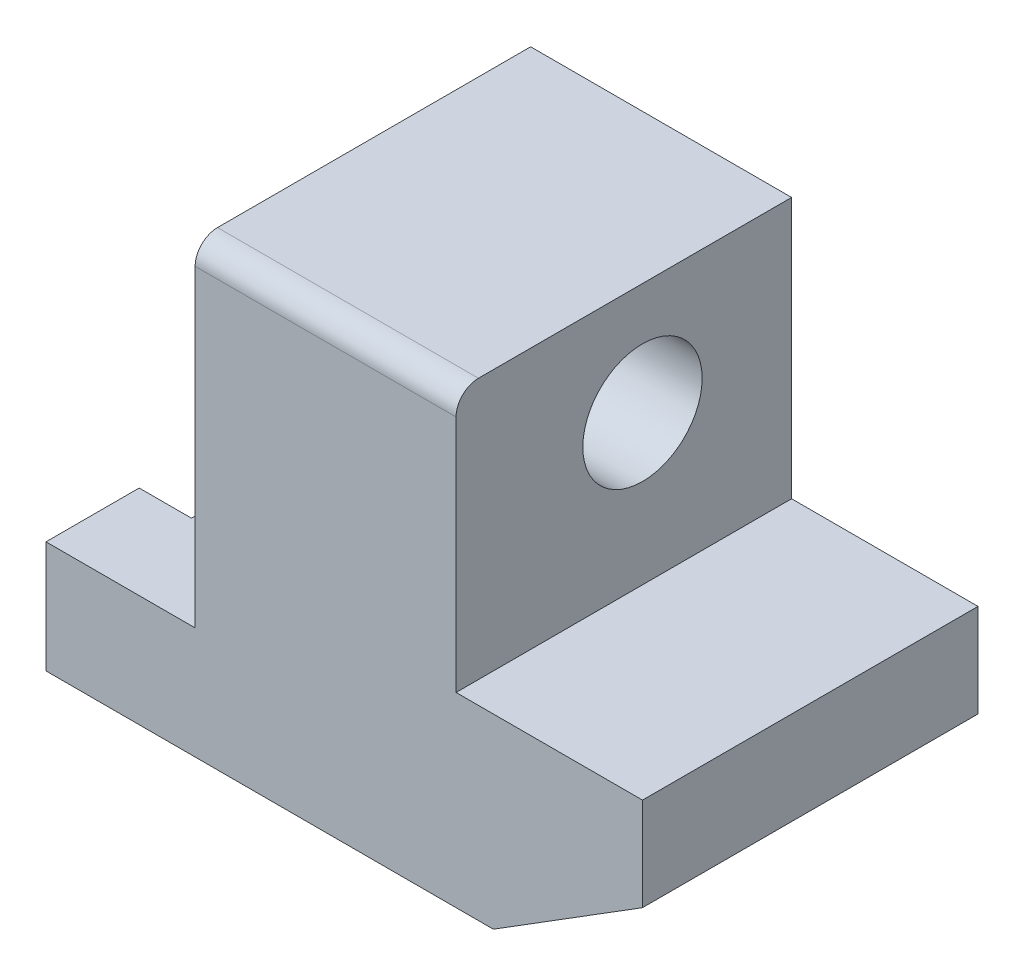
ISO-10303-21;
HEADER;
FILE_DESCRIPTION(('STEP AP214'),'2;1');
FILE_NAME('part.step','',(''),(''),'','','');
FILE_SCHEMA(('AUTOMOTIVE_DESIGN { 1 0 10303 214 1 1 1 1 }'));
ENDSEC;
DATA;
#1=APPLICATION_CONTEXT('core data for automotive mechanical design processes');
#2=APPLICATION_PROTOCOL_DEFINITION('international standard','automotive_design',2000,#1);
#3=PRODUCT_CONTEXT('',#1,'mechanical');
#4=PRODUCT('Part','Part','',(#3));
#5=PRODUCT_RELATED_PRODUCT_CATEGORY('part','',(#4));
#6=PRODUCT_DEFINITION_FORMATION('','',#4);
#7=PRODUCT_DEFINITION_CONTEXT('part definition',#1,'design');
#8=PRODUCT_DEFINITION('design','',#6,#7);
#9=PRODUCT_DEFINITION_SHAPE('','',#8);
#10=(LENGTH_UNIT() NAMED_UNIT(*) SI_UNIT(.MILLI.,.METRE.));
#11=(NAMED_UNIT(*) PLANE_ANGLE_UNIT() SI_UNIT($,.RADIAN.));
#12=(NAMED_UNIT(*) SI_UNIT($,.STERADIAN.) SOLID_ANGLE_UNIT());
#13=UNCERTAINTY_MEASURE_WITH_UNIT(LENGTH_MEASURE(1.E-05),#10,'distance_accuracy_value','');
#14=(GEOMETRIC_REPRESENTATION_CONTEXT(3) GLOBAL_UNCERTAINTY_ASSIGNED_CONTEXT((#13)) GLOBAL_UNIT_ASSIGNED_CONTEXT((#10,
#11,#12)) REPRESENTATION_CONTEXT('',''));
#15=CARTESIAN_POINT('',(0.,0.,0.));
#16=DIRECTION('',(0.,0.,1.));
#17=DIRECTION('',(1.,0.,0.));
#18=AXIS2_PLACEMENT_3D('',#15,#16,#17);
#19=CARTESIAN_POINT('',(0.,0.,0.));
#20=DIRECTION('',(1.,0.,0.));
#21=DIRECTION('',(0.,0.,-1.));
#22=AXIS2_PLACEMENT_3D('',#19,#20,#21);
#23=PLANE('',#22);
#24=DIRECTION('',(0.,0.,-1.));
#25=VECTOR('',#24,1.);
#26=CARTESIAN_POINT('',(0.,0.,0.));
#27=LINE('',#26,#25);
#28=CARTESIAN_POINT('',(0.,0.,-65.));
#29=VERTEX_POINT('',#28);
#30=CARTESIAN_POINT('',(0.,0.,-90.));
#31=VERTEX_POINT('',#30);
#32=EDGE_CURVE('E152',#29,#31,#27,.T.);
#33=ORIENTED_EDGE('',*,*,#32,.F.);
#34=DIRECTION('',(0.,-1.,0.));
#35=VECTOR('',#34,1.);
#36=CARTESIAN_POINT('',(0.,0.,-65.));
#37=LINE('',#36,#35);
#38=CARTESIAN_POINT('',(0.,30.,-65.));
#39=VERTEX_POINT('',#38);
#40=EDGE_CURVE('E265',#39,#29,#37,.T.);
#41=ORIENTED_EDGE('',*,*,#40,.F.);
#42=DIRECTION('',(0.,0.,1.));
#43=VECTOR('',#42,1.);
#44=CARTESIAN_POINT('',(0.,30.,0.));
#45=LINE('',#44,#43);
#46=CARTESIAN_POINT('',(0.,30.,-90.));
#47=VERTEX_POINT('',#46);
#48=EDGE_CURVE('E228',#47,#39,#45,.T.);
#49=ORIENTED_EDGE('',*,*,#48,.F.);
#50=DIRECTION('',(0.,1.,0.));
#51=VECTOR('',#50,1.);
#52=CARTESIAN_POINT('',(0.,0.,-90.));
#53=LINE('',#52,#51);
#54=EDGE_CURVE('E225',#31,#47,#53,.T.);
#55=ORIENTED_EDGE('',*,*,#54,.F.);
#56=EDGE_LOOP('',(#33,#41,#49,#55));
#57=FACE_BOUND('',#56,.T.);
#58=ADVANCED_FACE('F33',(#57),#23,.F.);
#59=CARTESIAN_POINT('',(40.,0.,0.));
#60=DIRECTION('',(0.,1.,0.));
#61=DIRECTION('',(0.,0.,1.));
#62=AXIS2_PLACEMENT_3D('',#59,#60,#61);
#63=PLANE('',#62);
#64=DIRECTION('',(-1.,0.,0.));
#65=VECTOR('',#64,1.);
#66=CARTESIAN_POINT('',(40.,0.,-90.));
#67=LINE('',#66,#65);
#68=CARTESIAN_POINT('',(120.,0.,-90.));
#69=VERTEX_POINT('',#68);
#70=EDGE_CURVE('E144',#69,#31,#67,.T.);
#71=ORIENTED_EDGE('',*,*,#70,.F.);
#72=DIRECTION('',(0.,0.,1.));
#73=VECTOR('',#72,1.);
#74=CARTESIAN_POINT('',(120.,0.,-90.));
#75=LINE('',#74,#73);
#76=CARTESIAN_POINT('',(120.,0.,0.));
#77=VERTEX_POINT('',#76);
#78=EDGE_CURVE('E131',#69,#77,#75,.T.);
#79=ORIENTED_EDGE('',*,*,#78,.T.);
#80=DIRECTION('',(-1.,0.,0.));
#81=VECTOR('',#80,1.);
#82=CARTESIAN_POINT('',(40.,0.,0.));
#83=LINE('',#82,#81);
#84=CARTESIAN_POINT('',(0.,0.,0.));
#85=VERTEX_POINT('',#84);
#86=EDGE_CURVE('E220',#77,#85,#83,.T.);
#87=ORIENTED_EDGE('',*,*,#86,.T.);
#88=CARTESIAN_POINT('',(0.,0.,-25.));
#89=VERTEX_POINT('',#88);
#90=EDGE_CURVE('E222',#85,#89,#27,.T.);
#91=ORIENTED_EDGE('',*,*,#90,.T.);
#92=DIRECTION('',(-1.,0.,0.));
#93=VECTOR('',#92,1.);
#94=CARTESIAN_POINT('',(13.9999999999999,0.,-25.));
#95=LINE('',#94,#93);
#96=CARTESIAN_POINT('',(13.9999999999999,0.,-25.));
#97=VERTEX_POINT('',#96);
#98=EDGE_CURVE('E56',#97,#89,#95,.T.);
#99=ORIENTED_EDGE('',*,*,#98,.F.);
#100=DIRECTION('',(0.,0.,1.));
#101=VECTOR('',#100,1.);
#102=CARTESIAN_POINT('',(13.9999999999999,0.,-25.));
#103=LINE('',#102,#101);
#104=CARTESIAN_POINT('',(13.9999999999999,0.,-65.));
#105=VERTEX_POINT('',#104);
#106=EDGE_CURVE('E267',#105,#97,#103,.T.);
#107=ORIENTED_EDGE('',*,*,#106,.F.);
#108=DIRECTION('',(-1.,0.,0.));
#109=VECTOR('',#108,1.);
#110=CARTESIAN_POINT('',(13.9999999999999,0.,-65.));
#111=LINE('',#110,#109);
#112=EDGE_CURVE('E256',#105,#29,#111,.T.);
#113=ORIENTED_EDGE('',*,*,#112,.T.);
#114=ORIENTED_EDGE('',*,*,#32,.T.);
#115=EDGE_LOOP('',(#71,#79,#87,#91,#99,#107,#113,#114));
#116=FACE_BOUND('',#115,.T.);
#117=ADVANCED_FACE('F149',(#116),#63,.F.);
#118=CARTESIAN_POINT('',(40.,0.,-90.));
#119=DIRECTION('',(0.,0.,1.));
#120=DIRECTION('',(1.,0.,0.));
#121=AXIS2_PLACEMENT_3D('',#118,#119,#120);
#122=PLANE('',#121);
#123=DIRECTION('',(0.,1.,0.));
#124=VECTOR('',#123,1.);
#125=CARTESIAN_POINT('',(160.,0.,-90.));
#126=LINE('',#125,#124);
#127=CARTESIAN_POINT('',(160.,25.,-90.));
#128=VERTEX_POINT('',#127);
#129=CARTESIAN_POINT('',(160.,50.,-90.));
#130=VERTEX_POINT('',#129);
#131=EDGE_CURVE('E147',#128,#130,#126,.T.);
#132=ORIENTED_EDGE('',*,*,#131,.F.);
#133=DIRECTION('',(-0.847998304005088,-0.52999894000318,0.));
#134=VECTOR('',#133,1.);
#135=CARTESIAN_POINT('',(120.,0.,-90.));
#136=LINE('',#135,#134);
#137=EDGE_CURVE('E48',#128,#69,#136,.T.);
#138=ORIENTED_EDGE('',*,*,#137,.T.);
#139=ORIENTED_EDGE('',*,*,#70,.T.);
#140=ORIENTED_EDGE('',*,*,#54,.T.);
#141=DIRECTION('',(-1.,0.,0.));
#142=VECTOR('',#141,1.);
#143=CARTESIAN_POINT('',(40.,30.,-90.));
#144=LINE('',#143,#142);
#145=CARTESIAN_POINT('',(40.,30.,-90.));
#146=VERTEX_POINT('',#145);
#147=EDGE_CURVE('E155',#146,#47,#144,.T.);
#148=ORIENTED_EDGE('',*,*,#147,.F.);
#149=DIRECTION('',(0.,-1.,0.));
#150=VECTOR('',#149,1.);
#151=CARTESIAN_POINT('',(40.,0.,-90.));
#152=LINE('',#151,#150);
#153=CARTESIAN_POINT('',(40.,120.,-90.));
#154=VERTEX_POINT('',#153);
#155=EDGE_CURVE('E205',#154,#146,#152,.T.);
#156=ORIENTED_EDGE('',*,*,#155,.F.);
#157=DIRECTION('',(-1.,0.,0.));
#158=VECTOR('',#157,1.);
#159=CARTESIAN_POINT('',(40.,120.,-90.));
#160=LINE('',#159,#158);
#161=CARTESIAN_POINT('',(110.,120.,-90.));
#162=VERTEX_POINT('',#161);
#163=EDGE_CURVE('E218',#162,#154,#160,.T.);
#164=ORIENTED_EDGE('',*,*,#163,.F.);
#165=DIRECTION('',(0.,1.,0.));
#166=VECTOR('',#165,1.);
#167=CARTESIAN_POINT('',(110.,104.242681345273,-90.));
#168=LINE('',#167,#166);
#169=CARTESIAN_POINT('',(110.,50.,-90.));
#170=VERTEX_POINT('',#169);
#171=EDGE_CURVE('E187',#170,#162,#168,.T.);
#172=ORIENTED_EDGE('',*,*,#171,.F.);
#173=DIRECTION('',(-1.,0.,0.));
#174=VECTOR('',#173,1.);
#175=CARTESIAN_POINT('',(110.,50.,-90.));
#176=LINE('',#175,#174);
#177=EDGE_CURVE('E250',#130,#170,#176,.T.);
#178=ORIENTED_EDGE('',*,*,#177,.F.);
#179=EDGE_LOOP('',(#132,#138,#139,#140,#148,#156,#164,#172,#178));
#180=FACE_BOUND('',#179,.T.);
#181=ADVANCED_FACE('F143',(#180),#122,.F.);
#182=CARTESIAN_POINT('',(40.,30.,0.));
#183=DIRECTION('',(0.,-1.,0.));
#184=DIRECTION('',(0.,0.,-1.));
#185=AXIS2_PLACEMENT_3D('',#182,#183,#184);
#186=PLANE('',#185);
#187=ORIENTED_EDGE('',*,*,#48,.T.);
#188=DIRECTION('',(-1.,0.,0.));
#189=VECTOR('',#188,1.);
#190=CARTESIAN_POINT('',(13.9999999999999,30.,-65.));
#191=LINE('',#190,#189);
#192=CARTESIAN_POINT('',(13.9999999999999,30.,-65.));
#193=VERTEX_POINT('',#192);
#194=EDGE_CURVE('E262',#193,#39,#191,.T.);
#195=ORIENTED_EDGE('',*,*,#194,.F.);
#196=DIRECTION('',(0.,0.,-1.));
#197=VECTOR('',#196,1.);
#198=CARTESIAN_POINT('',(13.9999999999999,30.,-65.));
#199=LINE('',#198,#197);
#200=CARTESIAN_POINT('',(13.9999999999999,30.,-25.));
#201=VERTEX_POINT('',#200);
#202=EDGE_CURVE('E271',#201,#193,#199,.T.);
#203=ORIENTED_EDGE('',*,*,#202,.F.);
#204=DIRECTION('',(-1.,0.,0.));
#205=VECTOR('',#204,1.);
#206=CARTESIAN_POINT('',(13.9999999999999,30.,-25.));
#207=LINE('',#206,#205);
#208=CARTESIAN_POINT('',(0.,30.,-25.));
#209=VERTEX_POINT('',#208);
#210=EDGE_CURVE('E258',#201,#209,#207,.T.);
#211=ORIENTED_EDGE('',*,*,#210,.T.);
#212=CARTESIAN_POINT('',(0.,30.,0.));
#213=VERTEX_POINT('',#212);
#214=EDGE_CURVE('E227',#209,#213,#45,.T.);
#215=ORIENTED_EDGE('',*,*,#214,.T.);
#216=DIRECTION('',(-1.,0.,0.));
#217=VECTOR('',#216,1.);
#218=CARTESIAN_POINT('',(40.,30.,0.));
#219=LINE('',#218,#217);
#220=CARTESIAN_POINT('',(40.,30.,0.));
#221=VERTEX_POINT('',#220);
#222=EDGE_CURVE('E161',#221,#213,#219,.T.);
#223=ORIENTED_EDGE('',*,*,#222,.F.);
#224=DIRECTION('',(0.,0.,1.));
#225=VECTOR('',#224,1.);
#226=CARTESIAN_POINT('',(40.,30.,0.));
#227=LINE('',#226,#225);
#228=EDGE_CURVE('E204',#146,#221,#227,.T.);
#229=ORIENTED_EDGE('',*,*,#228,.F.);
#230=ORIENTED_EDGE('',*,*,#147,.T.);
#231=EDGE_LOOP('',(#187,#195,#203,#211,#215,#223,#229,#230));
#232=FACE_BOUND('',#231,.T.);
#233=ADVANCED_FACE('F286',(#232),#186,.F.);
#234=CARTESIAN_POINT('',(40.,0.,0.));
#235=DIRECTION('',(0.,0.,-1.));
#236=DIRECTION('',(0.,1.,0.));
#237=AXIS2_PLACEMENT_3D('',#234,#235,#236);
#238=PLANE('',#237);
#239=ORIENTED_EDGE('',*,*,#86,.F.);
#240=DIRECTION('',(-0.847998304005088,-0.52999894000318,0.));
#241=VECTOR('',#240,1.);
#242=CARTESIAN_POINT('',(120.,0.,0.));
#243=LINE('',#242,#241);
#244=CARTESIAN_POINT('',(160.,25.,0.));
#245=VERTEX_POINT('',#244);
#246=EDGE_CURVE('E134',#245,#77,#243,.T.);
#247=ORIENTED_EDGE('',*,*,#246,.F.);
#248=DIRECTION('',(0.,1.,0.));
#249=VECTOR('',#248,1.);
#250=CARTESIAN_POINT('',(160.,0.,0.));
#251=LINE('',#250,#249);
#252=CARTESIAN_POINT('',(160.,50.,0.));
#253=VERTEX_POINT('',#252);
#254=EDGE_CURVE('E167',#245,#253,#251,.T.);
#255=ORIENTED_EDGE('',*,*,#254,.T.);
#256=DIRECTION('',(-1.,0.,0.));
#257=VECTOR('',#256,1.);
#258=CARTESIAN_POINT('',(110.,50.,0.));
#259=LINE('',#258,#257);
#260=CARTESIAN_POINT('',(110.,50.,0.));
#261=VERTEX_POINT('',#260);
#262=EDGE_CURVE('E208',#253,#261,#259,.T.);
#263=ORIENTED_EDGE('',*,*,#262,.T.);
#264=DIRECTION('',(0.,1.,0.));
#265=VECTOR('',#264,1.);
#266=CARTESIAN_POINT('',(110.,120.,0.));
#267=LINE('',#266,#265);
#268=CARTESIAN_POINT('',(110.,114.,0.));
#269=VERTEX_POINT('',#268);
#270=EDGE_CURVE('E198',#261,#269,#267,.T.);
#271=ORIENTED_EDGE('',*,*,#270,.T.);
#272=DIRECTION('',(-1.,0.,0.));
#273=VECTOR('',#272,1.);
#274=CARTESIAN_POINT('',(40.,114.,0.));
#275=LINE('',#274,#273);
#276=CARTESIAN_POINT('',(40.,114.,0.));
#277=VERTEX_POINT('',#276);
#278=EDGE_CURVE('E154',#269,#277,#275,.T.);
#279=ORIENTED_EDGE('',*,*,#278,.T.);
#280=DIRECTION('',(0.,-1.,0.));
#281=VECTOR('',#280,1.);
#282=CARTESIAN_POINT('',(40.,30.,0.));
#283=LINE('',#282,#281);
#284=EDGE_CURVE('E195',#277,#221,#283,.T.);
#285=ORIENTED_EDGE('',*,*,#284,.T.);
#286=ORIENTED_EDGE('',*,*,#222,.T.);
#287=DIRECTION('',(0.,-1.,0.));
#288=VECTOR('',#287,1.);
#289=CARTESIAN_POINT('',(0.,0.,0.));
#290=LINE('',#289,#288);
#291=EDGE_CURVE('E221',#213,#85,#290,.T.);
#292=ORIENTED_EDGE('',*,*,#291,.T.);
#293=EDGE_LOOP('',(#239,#247,#255,#263,#271,#279,#285,#286,#292));
#294=FACE_BOUND('',#293,.T.);
#295=ADVANCED_FACE('F193',(#294),#238,.F.);
#296=ORIENTED_EDGE('',*,*,#214,.F.);
#297=DIRECTION('',(0.,1.,0.));
#298=VECTOR('',#297,1.);
#299=CARTESIAN_POINT('',(0.,30.,-25.));
#300=LINE('',#299,#298);
#301=EDGE_CURVE('E138',#89,#209,#300,.T.);
#302=ORIENTED_EDGE('',*,*,#301,.F.);
#303=ORIENTED_EDGE('',*,*,#90,.F.);
#304=ORIENTED_EDGE('',*,*,#291,.F.);
#305=EDGE_LOOP('',(#296,#302,#303,#304));
#306=FACE_BOUND('',#305,.T.);
#307=ADVANCED_FACE('F238',(#306),#23,.F.);
#308=CARTESIAN_POINT('',(40.,30.,-90.));
#309=DIRECTION('',(-1.,0.,0.));
#310=DIRECTION('',(0.,0.,1.));
#311=AXIS2_PLACEMENT_3D('',#308,#309,#310);
#312=PLANE('',#311);
#313=CARTESIAN_POINT('',(40.,90.,-50.));
#314=DIRECTION('',(-1.,0.,0.));
#315=DIRECTION('',(0.,0.,1.));
#316=AXIS2_PLACEMENT_3D('',#313,#314,#315);
#317=CIRCLE('',#316,16.);
#318=CARTESIAN_POINT('',(40.,90.,-34.));
#319=VERTEX_POINT('',#318);
#320=EDGE_CURVE('E168',#319,#319,#317,.T.);
#321=ORIENTED_EDGE('',*,*,#320,.F.);
#322=EDGE_LOOP('',(#321));
#323=FACE_BOUND('',#322,.T.);
#324=ORIENTED_EDGE('',*,*,#284,.F.);
#325=CARTESIAN_POINT('',(40.,114.,-6.));
#326=DIRECTION('',(-1.,0.,0.));
#327=DIRECTION('',(0.,0.,1.));
#328=AXIS2_PLACEMENT_3D('',#325,#326,#327);
#329=CIRCLE('',#328,6.);
#330=CARTESIAN_POINT('',(40.,120.,-6.00000000000001));
#331=VERTEX_POINT('',#330);
#332=EDGE_CURVE('E158',#277,#331,#329,.T.);
#333=ORIENTED_EDGE('',*,*,#332,.T.);
#334=DIRECTION('',(0.,0.,1.));
#335=VECTOR('',#334,1.);
#336=CARTESIAN_POINT('',(40.,120.,-90.));
#337=LINE('',#336,#335);
#338=EDGE_CURVE('E180',#154,#331,#337,.T.);
#339=ORIENTED_EDGE('',*,*,#338,.F.);
#340=ORIENTED_EDGE('',*,*,#155,.T.);
#341=ORIENTED_EDGE('',*,*,#228,.T.);
#342=EDGE_LOOP('',(#324,#333,#339,#340,#341));
#343=FACE_BOUND('',#342,.T.);
#344=ADVANCED_FACE('F201',(#323,#343),#312,.T.);
#345=CARTESIAN_POINT('',(40.,120.,-90.));
#346=DIRECTION('',(0.,1.,0.));
#347=DIRECTION('',(0.,0.,1.));
#348=AXIS2_PLACEMENT_3D('',#345,#346,#347);
#349=PLANE('',#348);
#350=ORIENTED_EDGE('',*,*,#338,.T.);
#351=DIRECTION('',(-1.,0.,0.));
#352=VECTOR('',#351,1.);
#353=CARTESIAN_POINT('',(110.,120.,-6.));
#354=LINE('',#353,#352);
#355=CARTESIAN_POINT('',(110.,120.,-6.00000000000001));
#356=VERTEX_POINT('',#355);
#357=EDGE_CURVE('E41',#331,#356,#354,.F.);
#358=ORIENTED_EDGE('',*,*,#357,.T.);
#359=DIRECTION('',(0.,0.,1.));
#360=VECTOR('',#359,1.);
#361=CARTESIAN_POINT('',(110.,120.,-90.));
#362=LINE('',#361,#360);
#363=EDGE_CURVE('E177',#162,#356,#362,.T.);
#364=ORIENTED_EDGE('',*,*,#363,.F.);
#365=ORIENTED_EDGE('',*,*,#163,.T.);
#366=EDGE_LOOP('',(#350,#358,#364,#365));
#367=FACE_BOUND('',#366,.T.);
#368=ADVANCED_FACE('F175',(#367),#349,.T.);
#369=CARTESIAN_POINT('',(110.,120.,-90.));
#370=DIRECTION('',(1.,0.,0.));
#371=DIRECTION('',(0.,0.,-1.));
#372=AXIS2_PLACEMENT_3D('',#369,#370,#371);
#373=PLANE('',#372);
#374=CARTESIAN_POINT('',(110.,90.,-50.));
#375=DIRECTION('',(1.,0.,0.));
#376=DIRECTION('',(0.,0.,-1.));
#377=AXIS2_PLACEMENT_3D('',#374,#375,#376);
#378=CIRCLE('',#377,16.);
#379=CARTESIAN_POINT('',(110.,90.,-66.));
#380=VERTEX_POINT('',#379);
#381=EDGE_CURVE('E165',#380,#380,#378,.T.);
#382=ORIENTED_EDGE('',*,*,#381,.F.);
#383=EDGE_LOOP('',(#382));
#384=FACE_BOUND('',#383,.T.);
#385=ORIENTED_EDGE('',*,*,#363,.T.);
#386=CARTESIAN_POINT('',(110.,114.,-6.));
#387=DIRECTION('',(1.,0.,0.));
#388=DIRECTION('',(0.,0.,-1.));
#389=AXIS2_PLACEMENT_3D('',#386,#387,#388);
#390=CIRCLE('',#389,6.);
#391=EDGE_CURVE('E11',#356,#269,#390,.T.);
#392=ORIENTED_EDGE('',*,*,#391,.T.);
#393=ORIENTED_EDGE('',*,*,#270,.F.);
#394=DIRECTION('',(0.,0.,1.));
#395=VECTOR('',#394,1.);
#396=CARTESIAN_POINT('',(110.,50.,-90.));
#397=LINE('',#396,#395);
#398=EDGE_CURVE('E188',#170,#261,#397,.T.);
#399=ORIENTED_EDGE('',*,*,#398,.F.);
#400=ORIENTED_EDGE('',*,*,#171,.T.);
#401=EDGE_LOOP('',(#385,#392,#393,#399,#400));
#402=FACE_BOUND('',#401,.T.);
#403=ADVANCED_FACE('F184',(#384,#402),#373,.T.);
#404=CARTESIAN_POINT('',(110.,50.,-90.));
#405=DIRECTION('',(0.,1.,0.));
#406=DIRECTION('',(0.,0.,1.));
#407=AXIS2_PLACEMENT_3D('',#404,#405,#406);
#408=PLANE('',#407);
#409=ORIENTED_EDGE('',*,*,#262,.F.);
#410=DIRECTION('',(0.,0.,1.));
#411=VECTOR('',#410,1.);
#412=CARTESIAN_POINT('',(160.,50.,-90.));
#413=LINE('',#412,#411);
#414=EDGE_CURVE('E215',#130,#253,#413,.T.);
#415=ORIENTED_EDGE('',*,*,#414,.F.);
#416=ORIENTED_EDGE('',*,*,#177,.T.);
#417=ORIENTED_EDGE('',*,*,#398,.T.);
#418=EDGE_LOOP('',(#409,#415,#416,#417));
#419=FACE_BOUND('',#418,.T.);
#420=ADVANCED_FACE('F289',(#419),#408,.T.);
#421=CARTESIAN_POINT('',(160.,0.,-90.));
#422=DIRECTION('',(1.,0.,0.));
#423=DIRECTION('',(0.,0.,-1.));
#424=AXIS2_PLACEMENT_3D('',#421,#422,#423);
#425=PLANE('',#424);
#426=DIRECTION('',(0.,0.,1.));
#427=VECTOR('',#426,1.);
#428=CARTESIAN_POINT('',(160.,25.,-90.));
#429=LINE('',#428,#427);
#430=EDGE_CURVE('E139',#128,#245,#429,.T.);
#431=ORIENTED_EDGE('',*,*,#430,.F.);
#432=ORIENTED_EDGE('',*,*,#131,.T.);
#433=ORIENTED_EDGE('',*,*,#414,.T.);
#434=ORIENTED_EDGE('',*,*,#254,.F.);
#435=EDGE_LOOP('',(#431,#432,#433,#434));
#436=FACE_BOUND('',#435,.T.);
#437=ADVANCED_FACE('F243',(#436),#425,.T.);
#438=CARTESIAN_POINT('',(160.,90.,-50.));
#439=DIRECTION('',(-1.,0.,0.));
#440=DIRECTION('',(0.,0.,1.));
#441=AXIS2_PLACEMENT_3D('',#438,#439,#440);
#442=CYLINDRICAL_SURFACE('',#441,16.);
#443=ORIENTED_EDGE('',*,*,#381,.T.);
#444=EDGE_LOOP('',(#443));
#445=FACE_BOUND('',#444,.T.);
#446=ORIENTED_EDGE('',*,*,#320,.T.);
#447=EDGE_LOOP('',(#446));
#448=FACE_BOUND('',#447,.T.);
#449=ADVANCED_FACE('F296',(#445,#448),#442,.F.);
#450=CARTESIAN_POINT('',(40.,114.,-6.));
#451=DIRECTION('',(1.,0.,0.));
#452=DIRECTION('',(0.,0.,-1.));
#453=AXIS2_PLACEMENT_3D('',#450,#451,#452);
#454=CYLINDRICAL_SURFACE('',#453,6.);
#455=ORIENTED_EDGE('',*,*,#391,.F.);
#456=ORIENTED_EDGE('',*,*,#357,.F.);
#457=ORIENTED_EDGE('',*,*,#332,.F.);
#458=ORIENTED_EDGE('',*,*,#278,.F.);
#459=EDGE_LOOP('',(#455,#456,#457,#458));
#460=FACE_BOUND('',#459,.T.);
#461=ADVANCED_FACE('F35',(#460),#454,.T.);
#462=CARTESIAN_POINT('',(13.9999999999999,0.,-65.));
#463=DIRECTION('',(0.,0.,-1.));
#464=DIRECTION('',(-1.,0.,0.));
#465=AXIS2_PLACEMENT_3D('',#462,#463,#464);
#466=PLANE('',#465);
#467=ORIENTED_EDGE('',*,*,#40,.T.);
#468=ORIENTED_EDGE('',*,*,#112,.F.);
#469=DIRECTION('',(0.,-1.,0.));
#470=VECTOR('',#469,1.);
#471=CARTESIAN_POINT('',(13.9999999999999,0.,-65.));
#472=LINE('',#471,#470);
#473=EDGE_CURVE('E259',#193,#105,#472,.T.);
#474=ORIENTED_EDGE('',*,*,#473,.F.);
#475=ORIENTED_EDGE('',*,*,#194,.T.);
#476=EDGE_LOOP('',(#467,#468,#474,#475));
#477=FACE_BOUND('',#476,.T.);
#478=ADVANCED_FACE('F343',(#477),#466,.F.);
#479=CARTESIAN_POINT('',(13.9999999999999,30.,-25.));
#480=DIRECTION('',(0.,0.,1.));
#481=DIRECTION('',(0.,-1.,0.));
#482=AXIS2_PLACEMENT_3D('',#479,#480,#481);
#483=PLANE('',#482);
#484=ORIENTED_EDGE('',*,*,#301,.T.);
#485=ORIENTED_EDGE('',*,*,#210,.F.);
#486=DIRECTION('',(0.,1.,0.));
#487=VECTOR('',#486,1.);
#488=CARTESIAN_POINT('',(13.9999999999999,30.,-25.));
#489=LINE('',#488,#487);
#490=EDGE_CURVE('E273',#97,#201,#489,.T.);
#491=ORIENTED_EDGE('',*,*,#490,.F.);
#492=ORIENTED_EDGE('',*,*,#98,.T.);
#493=EDGE_LOOP('',(#484,#485,#491,#492));
#494=FACE_BOUND('',#493,.T.);
#495=ADVANCED_FACE('F348',(#494),#483,.F.);
#496=CARTESIAN_POINT('',(13.9999999999999,0.,0.));
#497=DIRECTION('',(1.,0.,0.));
#498=DIRECTION('',(0.,0.,-1.));
#499=AXIS2_PLACEMENT_3D('',#496,#497,#498);
#500=PLANE('',#499);
#501=ORIENTED_EDGE('',*,*,#106,.T.);
#502=ORIENTED_EDGE('',*,*,#490,.T.);
#503=ORIENTED_EDGE('',*,*,#202,.T.);
#504=ORIENTED_EDGE('',*,*,#473,.T.);
#505=EDGE_LOOP('',(#501,#502,#503,#504));
#506=FACE_BOUND('',#505,.T.);
#507=ADVANCED_FACE('F279',(#506),#500,.F.);
#508=CARTESIAN_POINT('',(120.,0.,-90.));
#509=DIRECTION('',(-0.52999894000318,0.847998304005088,0.));
#510=DIRECTION('',(-0.847998304005088,-0.52999894000318,0.));
#511=AXIS2_PLACEMENT_3D('',#508,#509,#510);
#512=PLANE('',#511);
#513=ORIENTED_EDGE('',*,*,#246,.T.);
#514=ORIENTED_EDGE('',*,*,#78,.F.);
#515=ORIENTED_EDGE('',*,*,#137,.F.);
#516=ORIENTED_EDGE('',*,*,#430,.T.);
#517=EDGE_LOOP('',(#513,#514,#515,#516));
#518=FACE_BOUND('',#517,.T.);
#519=ADVANCED_FACE('F132',(#518),#512,.F.);
#520=CLOSED_SHELL('',(#58,#117,#181,#233,#295,#307,#344,#368,#403,#420,#437,#449,#461,#478,#495,
#507,#519));
#521=MANIFOLD_SOLID_BREP('B2',#520);
#522=ADVANCED_BREP_SHAPE_REPRESENTATION('',(#18,#521),#14);
#523=SHAPE_DEFINITION_REPRESENTATION(#9,#522);
ENDSEC;
END-ISO-10303-21;
